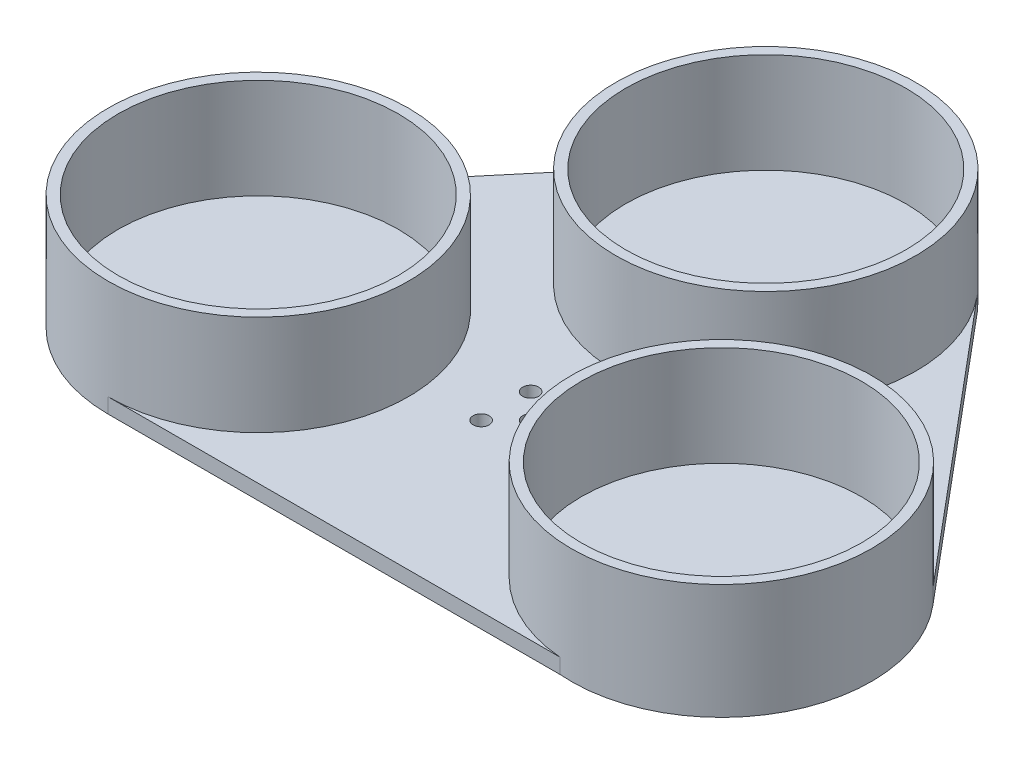
ISO-10303-21;
HEADER;
FILE_DESCRIPTION(('STEP AP214'),'2;1');
FILE_NAME('part.step','',(''),(''),'','','');
FILE_SCHEMA(('AUTOMOTIVE_DESIGN { 1 0 10303 214 1 1 1 1 }'));
ENDSEC;
DATA;
#1=APPLICATION_CONTEXT('core data for automotive mechanical design processes');
#2=APPLICATION_PROTOCOL_DEFINITION('international standard','automotive_design',2000,#1);
#3=PRODUCT_CONTEXT('',#1,'mechanical');
#4=PRODUCT('Part','Part','',(#3));
#5=PRODUCT_RELATED_PRODUCT_CATEGORY('part','',(#4));
#6=PRODUCT_DEFINITION_FORMATION('','',#4);
#7=PRODUCT_DEFINITION_CONTEXT('part definition',#1,'design');
#8=PRODUCT_DEFINITION('design','',#6,#7);
#9=PRODUCT_DEFINITION_SHAPE('','',#8);
#10=(LENGTH_UNIT() NAMED_UNIT(*) SI_UNIT(.MILLI.,.METRE.));
#11=(NAMED_UNIT(*) PLANE_ANGLE_UNIT() SI_UNIT($,.RADIAN.));
#12=(NAMED_UNIT(*) SI_UNIT($,.STERADIAN.) SOLID_ANGLE_UNIT());
#13=UNCERTAINTY_MEASURE_WITH_UNIT(LENGTH_MEASURE(1.E-05),#10,'distance_accuracy_value','');
#14=(GEOMETRIC_REPRESENTATION_CONTEXT(3) GLOBAL_UNCERTAINTY_ASSIGNED_CONTEXT((#13)) GLOBAL_UNIT_ASSIGNED_CONTEXT((#10,
#11,#12)) REPRESENTATION_CONTEXT('',''));
#15=CARTESIAN_POINT('',(0.,0.,0.));
#16=DIRECTION('',(0.,0.,1.));
#17=DIRECTION('',(1.,0.,0.));
#18=AXIS2_PLACEMENT_3D('',#15,#16,#17);
#19=CARTESIAN_POINT('',(-52.5255658839356,3.,-44.0741829605881));
#20=DIRECTION('',(0.766044443118979,0.,0.642787609686538));
#21=DIRECTION('',(0.642787609686538,0.,-0.766044443118979));
#22=AXIS2_PLACEMENT_3D('',#19,#20,#21);
#23=PLANE('',#22);
#24=DIRECTION('',(-0.642787609686538,0.,0.766044443118979));
#25=VECTOR('',#24,1.);
#26=CARTESIAN_POINT('',(-52.5255658839356,0.,-44.0741829605881));
#27=LINE('',#26,#25);
#28=CARTESIAN_POINT('',(-22.9813332935694,0.,-79.2836282905962));
#29=VERTEX_POINT('',#28);
#30=CARTESIAN_POINT('',(-69.2672976851431,0.,-24.1221639402503));
#31=VERTEX_POINT('',#30);
#32=EDGE_CURVE('E173',#29,#31,#27,.T.);
#33=ORIENTED_EDGE('',*,*,#32,.T.);
#34=DIRECTION('',(0.,-1.,0.));
#35=VECTOR('',#34,1.);
#36=CARTESIAN_POINT('',(-69.2672976851431,3.,-24.1221639402503));
#37=LINE('',#36,#35);
#38=CARTESIAN_POINT('',(-69.2672976851431,3.,-24.1221639402503));
#39=VERTEX_POINT('',#38);
#40=EDGE_CURVE('E198',#39,#31,#37,.T.);
#41=ORIENTED_EDGE('',*,*,#40,.F.);
#42=DIRECTION('',(-0.642787609686538,0.,0.766044443118979));
#43=VECTOR('',#42,1.);
#44=CARTESIAN_POINT('',(-52.5255658839356,3.,-44.0741829605881));
#45=LINE('',#44,#43);
#46=CARTESIAN_POINT('',(-22.9813332935694,3.,-79.2836282905962));
#47=VERTEX_POINT('',#46);
#48=EDGE_CURVE('E96',#47,#39,#45,.T.);
#49=ORIENTED_EDGE('',*,*,#48,.F.);
#50=DIRECTION('',(0.,-1.,0.));
#51=VECTOR('',#50,1.);
#52=CARTESIAN_POINT('',(-22.9813332935694,3.,-79.2836282905962));
#53=LINE('',#52,#51);
#54=EDGE_CURVE('E192',#47,#29,#53,.T.);
#55=ORIENTED_EDGE('',*,*,#54,.T.);
#56=EDGE_LOOP('',(#33,#41,#49,#55));
#57=FACE_BOUND('',#56,.T.);
#58=ADVANCED_FACE('F45',(#57),#23,.F.);
#59=CARTESIAN_POINT('',(-46.2859643915737,3.,-4.83853564965411));
#60=DIRECTION('',(0.,-1.,0.));
#61=DIRECTION('',(0.,0.,-1.));
#62=AXIS2_PLACEMENT_3D('',#59,#60,#61);
#63=CYLINDRICAL_SURFACE('',#62,30.);
#64=CARTESIAN_POINT('',(-46.2859643915737,0.,-4.83853564965411));
#65=DIRECTION('',(0.,1.,0.));
#66=DIRECTION('',(0.,0.,1.));
#67=AXIS2_PLACEMENT_3D('',#64,#65,#66);
#68=CIRCLE('',#67,30.);
#69=CARTESIAN_POINT('',(-46.2859643915737,0.,25.1614643503459));
#70=VERTEX_POINT('',#69);
#71=EDGE_CURVE('E179',#31,#70,#68,.T.);
#72=ORIENTED_EDGE('',*,*,#71,.T.);
#73=DIRECTION('',(0.,-1.,0.));
#74=VECTOR('',#73,1.);
#75=CARTESIAN_POINT('',(-46.2859643915737,3.,25.1614643503459));
#76=LINE('',#75,#74);
#77=CARTESIAN_POINT('',(-46.2859643915737,3.,25.1614643503459));
#78=VERTEX_POINT('',#77);
#79=EDGE_CURVE('E197',#78,#70,#76,.T.);
#80=ORIENTED_EDGE('',*,*,#79,.F.);
#81=CARTESIAN_POINT('',(-46.2859643915737,3.,-4.83853564965411));
#82=DIRECTION('',(0.,1.,0.));
#83=DIRECTION('',(0.,0.,1.));
#84=AXIS2_PLACEMENT_3D('',#81,#82,#83);
#85=CIRCLE('',#84,30.);
#86=CARTESIAN_POINT('',(-46.2220692104984,3.,25.1613963070326));
#87=VERTEX_POINT('',#86);
#88=EDGE_CURVE('E134',#78,#87,#85,.T.);
#89=ORIENTED_EDGE('',*,*,#88,.T.);
#90=CARTESIAN_POINT('',(-46.2859643915737,3.,-4.83853564965411));
#91=DIRECTION('',(0.,1.,0.));
#92=DIRECTION('',(0.,0.,1.));
#93=AXIS2_PLACEMENT_3D('',#90,#91,#92);
#94=CIRCLE('',#93,30.);
#95=EDGE_CURVE('E62',#87,#39,#94,.T.);
#96=ORIENTED_EDGE('',*,*,#95,.T.);
#97=ORIENTED_EDGE('',*,*,#40,.T.);
#98=EDGE_LOOP('',(#72,#80,#89,#96,#97));
#99=FACE_BOUND('',#98,.T.);
#100=CARTESIAN_POINT('',(-46.2859643915737,23.,-4.83853564965411));
#101=DIRECTION('',(0.,1.,0.));
#102=DIRECTION('',(0.,0.,1.));
#103=AXIS2_PLACEMENT_3D('',#100,#101,#102);
#104=CIRCLE('',#103,30.);
#105=CARTESIAN_POINT('',(-46.2859643915737,23.,25.1614643503459));
#106=VERTEX_POINT('',#105);
#107=EDGE_CURVE('E166',#106,#106,#104,.T.);
#108=ORIENTED_EDGE('',*,*,#107,.F.);
#109=EDGE_LOOP('',(#108));
#110=FACE_BOUND('',#109,.T.);
#111=ADVANCED_FACE('F223',(#99,#110),#63,.T.);
#112=CARTESIAN_POINT('',(0.0267424478385189,3.,25.1121449812582));
#113=DIRECTION('',(-0.00106492028836114,0.,-0.999999432972229));
#114=DIRECTION('',(-0.999999432972229,0.,0.00106492028836114));
#115=AXIS2_PLACEMENT_3D('',#112,#113,#114);
#116=PLANE('',#115);
#117=DIRECTION('',(0.999999432972229,0.,-0.00106492028836114));
#118=VECTOR('',#117,1.);
#119=CARTESIAN_POINT('',(0.0267424478385189,0.,25.1121449812582));
#120=LINE('',#119,#118);
#121=CARTESIAN_POINT('',(43.8875404004589,0.,25.0654367011699));
#122=VERTEX_POINT('',#121);
#123=EDGE_CURVE('E182',#70,#122,#120,.T.);
#124=ORIENTED_EDGE('',*,*,#123,.T.);
#125=DIRECTION('',(0.,-1.,0.));
#126=VECTOR('',#125,1.);
#127=CARTESIAN_POINT('',(43.8875404004589,3.,25.0654367011699));
#128=LINE('',#127,#126);
#129=CARTESIAN_POINT('',(43.8875404004589,3.,25.0654367011699));
#130=VERTEX_POINT('',#129);
#131=EDGE_CURVE('E124',#130,#122,#128,.T.);
#132=ORIENTED_EDGE('',*,*,#131,.F.);
#133=DIRECTION('',(0.999999432972229,0.,-0.00106492028836114));
#134=VECTOR('',#133,1.);
#135=CARTESIAN_POINT('',(0.0267424478385189,3.,25.1121449812582));
#136=LINE('',#135,#134);
#137=EDGE_CURVE('E137',#87,#130,#136,.T.);
#138=ORIENTED_EDGE('',*,*,#137,.F.);
#139=ORIENTED_EDGE('',*,*,#88,.F.);
#140=ORIENTED_EDGE('',*,*,#79,.T.);
#141=EDGE_LOOP('',(#124,#132,#138,#139,#140));
#142=FACE_BOUND('',#141,.T.);
#143=ADVANCED_FACE('F232',(#142),#116,.F.);
#144=CARTESIAN_POINT('',(46.2859643915737,3.,-4.8385356496541));
#145=DIRECTION('',(0.,-1.,0.));
#146=DIRECTION('',(0.,0.,-1.));
#147=AXIS2_PLACEMENT_3D('',#144,#145,#146);
#148=CYLINDRICAL_SURFACE('',#147,30.);
#149=CARTESIAN_POINT('',(46.2859643915737,0.,-4.8385356496541));
#150=DIRECTION('',(0.,1.,0.));
#151=DIRECTION('',(0.,0.,1.));
#152=AXIS2_PLACEMENT_3D('',#149,#150,#151);
#153=CIRCLE('',#152,30.);
#154=CARTESIAN_POINT('',(69.2662943523183,0.,-24.123359602579));
#155=VERTEX_POINT('',#154);
#156=EDGE_CURVE('E119',#122,#155,#153,.T.);
#157=ORIENTED_EDGE('',*,*,#156,.T.);
#158=DIRECTION('',(0.,-1.,0.));
#159=VECTOR('',#158,1.);
#160=CARTESIAN_POINT('',(69.2662943523183,3.,-24.123359602579));
#161=LINE('',#160,#159);
#162=CARTESIAN_POINT('',(69.2662943523183,3.,-24.123359602579));
#163=VERTEX_POINT('',#162);
#164=EDGE_CURVE('E111',#163,#155,#161,.T.);
#165=ORIENTED_EDGE('',*,*,#164,.F.);
#166=CARTESIAN_POINT('',(46.2859643915737,3.,-4.8385356496541));
#167=DIRECTION('',(0.,1.,0.));
#168=DIRECTION('',(0.,0.,1.));
#169=AXIS2_PLACEMENT_3D('',#166,#167,#168);
#170=CIRCLE('',#169,30.);
#171=EDGE_CURVE('E117',#163,#130,#170,.T.);
#172=ORIENTED_EDGE('',*,*,#171,.T.);
#173=ORIENTED_EDGE('',*,*,#131,.T.);
#174=EDGE_LOOP('',(#157,#165,#172,#173));
#175=FACE_BOUND('',#174,.T.);
#176=CARTESIAN_POINT('',(46.2859643915737,23.,-4.8385356496541));
#177=DIRECTION('',(0.,1.,0.));
#178=DIRECTION('',(0.,0.,1.));
#179=AXIS2_PLACEMENT_3D('',#176,#177,#178);
#180=CIRCLE('',#179,30.);
#181=CARTESIAN_POINT('',(46.2859643915737,23.,25.1614643503459));
#182=VERTEX_POINT('',#181);
#183=EDGE_CURVE('E141',#182,#182,#180,.T.);
#184=ORIENTED_EDGE('',*,*,#183,.F.);
#185=EDGE_LOOP('',(#184));
#186=FACE_BOUND('',#185,.T.);
#187=ADVANCED_FACE('F113',(#175,#186),#148,.T.);
#188=CARTESIAN_POINT('',(52.5222346194224,3.,-44.0760445990114));
#189=DIRECTION('',(0.766010998691486,0.,-0.642827465097495));
#190=DIRECTION('',(-0.642827465097495,0.,-0.766010998691487));
#191=AXIS2_PLACEMENT_3D('',#188,#189,#190);
#192=PLANE('',#191);
#193=DIRECTION('',(0.642827465097495,0.,0.766010998691487));
#194=VECTOR('',#193,1.);
#195=CARTESIAN_POINT('',(52.5222346194224,0.,-44.0760445990114));
#196=LINE('',#195,#194);
#197=CARTESIAN_POINT('',(22.6726925027574,0.,-79.6455851191918));
#198=VERTEX_POINT('',#197);
#199=EDGE_CURVE('E187',#198,#155,#196,.T.);
#200=ORIENTED_EDGE('',*,*,#199,.F.);
#201=DIRECTION('',(0.,-1.,0.));
#202=VECTOR('',#201,1.);
#203=CARTESIAN_POINT('',(22.6726925027574,3.,-79.6455851191918));
#204=LINE('',#203,#202);
#205=CARTESIAN_POINT('',(22.6726925027573,3.,-79.6455851191919));
#206=VERTEX_POINT('',#205);
#207=EDGE_CURVE('E125',#206,#198,#204,.T.);
#208=ORIENTED_EDGE('',*,*,#207,.F.);
#209=CARTESIAN_POINT('',(22.6726925027574,3.,-79.6455851191918));
#210=DIRECTION('',(0.642827465097495,0.,0.766010998691487));
#211=VECTOR('',#210,1.);
#212=LINE('',#209,#211);
#213=CARTESIAN_POINT('',(23.2822277130097,3.,-78.9192460927904));
#214=VERTEX_POINT('',#213);
#215=EDGE_CURVE('E131',#206,#214,#212,.T.);
#216=ORIENTED_EDGE('',*,*,#215,.T.);
#217=DIRECTION('',(0.642827465097495,0.,0.766010998691487));
#218=VECTOR('',#217,1.);
#219=CARTESIAN_POINT('',(52.5222346194224,3.,-44.0760445990114));
#220=LINE('',#219,#218);
#221=EDGE_CURVE('E128',#214,#163,#220,.T.);
#222=ORIENTED_EDGE('',*,*,#221,.T.);
#223=ORIENTED_EDGE('',*,*,#164,.T.);
#224=EDGE_LOOP('',(#200,#208,#216,#222,#223));
#225=FACE_BOUND('',#224,.T.);
#226=ADVANCED_FACE('F129',(#225),#192,.T.);
#227=CARTESIAN_POINT('',(0.,3.,-60.));
#228=DIRECTION('',(0.,-1.,0.));
#229=DIRECTION('',(0.,0.,-1.));
#230=AXIS2_PLACEMENT_3D('',#227,#228,#229);
#231=CYLINDRICAL_SURFACE('',#230,30.);
#232=CARTESIAN_POINT('',(0.,0.,-60.));
#233=DIRECTION('',(0.,1.,0.));
#234=DIRECTION('',(0.,0.,1.));
#235=AXIS2_PLACEMENT_3D('',#232,#233,#234);
#236=CIRCLE('',#235,30.);
#237=EDGE_CURVE('E93',#198,#29,#236,.T.);
#238=ORIENTED_EDGE('',*,*,#237,.T.);
#239=ORIENTED_EDGE('',*,*,#54,.F.);
#240=CARTESIAN_POINT('',(0.,3.,-60.));
#241=DIRECTION('',(0.,1.,0.));
#242=DIRECTION('',(0.,0.,1.));
#243=AXIS2_PLACEMENT_3D('',#240,#241,#242);
#244=CIRCLE('',#243,30.);
#245=EDGE_CURVE('E54',#214,#47,#244,.F.);
#246=ORIENTED_EDGE('',*,*,#245,.F.);
#247=ORIENTED_EDGE('',*,*,#215,.F.);
#248=ORIENTED_EDGE('',*,*,#207,.T.);
#249=EDGE_LOOP('',(#238,#239,#246,#247,#248));
#250=FACE_BOUND('',#249,.T.);
#251=CARTESIAN_POINT('',(0.,23.,-60.));
#252=DIRECTION('',(0.,1.,0.));
#253=DIRECTION('',(0.,0.,1.));
#254=AXIS2_PLACEMENT_3D('',#251,#252,#253);
#255=CIRCLE('',#254,30.);
#256=CARTESIAN_POINT('',(0.,23.,-30.));
#257=VERTEX_POINT('',#256);
#258=EDGE_CURVE('E146',#257,#257,#255,.T.);
#259=ORIENTED_EDGE('',*,*,#258,.F.);
#260=EDGE_LOOP('',(#259));
#261=FACE_BOUND('',#260,.T.);
#262=ADVANCED_FACE('F270',(#250,#261),#231,.T.);
#263=CARTESIAN_POINT('',(0.,3.,0.));
#264=DIRECTION('',(0.,1.,0.));
#265=DIRECTION('',(0.,0.,1.));
#266=AXIS2_PLACEMENT_3D('',#263,#264,#265);
#267=PLANE('',#266);
#268=CARTESIAN_POINT('',(-4.94974746830579,3.,-17.9497474683057));
#269=DIRECTION('',(0.,1.,0.));
#270=DIRECTION('',(0.,0.,1.));
#271=AXIS2_PLACEMENT_3D('',#268,#269,#270);
#272=CIRCLE('',#271,1.6);
#273=CARTESIAN_POINT('',(-4.94974746830579,3.,-16.3497474683057));
#274=VERTEX_POINT('',#273);
#275=EDGE_CURVE('E149',#274,#274,#272,.T.);
#276=ORIENTED_EDGE('',*,*,#275,.F.);
#277=EDGE_LOOP('',(#276));
#278=FACE_BOUND('',#277,.T.);
#279=CARTESIAN_POINT('',(-4.94974746830583,3.,-8.05025253169417));
#280=DIRECTION('',(0.,1.,0.));
#281=DIRECTION('',(0.,0.,1.));
#282=AXIS2_PLACEMENT_3D('',#279,#280,#281);
#283=CIRCLE('',#282,1.59999999999993);
#284=CARTESIAN_POINT('',(-4.94974746830583,3.,-6.45025253169424));
#285=VERTEX_POINT('',#284);
#286=EDGE_CURVE('E347',#285,#285,#283,.T.);
#287=ORIENTED_EDGE('',*,*,#286,.F.);
#288=EDGE_LOOP('',(#287));
#289=FACE_BOUND('',#288,.T.);
#290=CARTESIAN_POINT('',(4.94974746830596,3.,-8.05025253169416));
#291=DIRECTION('',(0.,1.,0.));
#292=DIRECTION('',(0.,0.,1.));
#293=AXIS2_PLACEMENT_3D('',#290,#291,#292);
#294=CIRCLE('',#293,1.6);
#295=CARTESIAN_POINT('',(4.94974746830596,3.,-6.45025253169416));
#296=VERTEX_POINT('',#295);
#297=EDGE_CURVE('E351',#296,#296,#294,.T.);
#298=ORIENTED_EDGE('',*,*,#297,.F.);
#299=EDGE_LOOP('',(#298));
#300=FACE_BOUND('',#299,.T.);
#301=CARTESIAN_POINT('',(4.94974746830583,3.,-17.9497474683058));
#302=DIRECTION('',(0.,1.,0.));
#303=DIRECTION('',(0.,0.,1.));
#304=AXIS2_PLACEMENT_3D('',#301,#302,#303);
#305=CIRCLE('',#304,1.59999999999999);
#306=CARTESIAN_POINT('',(4.94974746830583,3.,-16.3497474683058));
#307=VERTEX_POINT('',#306);
#308=EDGE_CURVE('E355',#307,#307,#305,.T.);
#309=ORIENTED_EDGE('',*,*,#308,.F.);
#310=EDGE_LOOP('',(#309));
#311=FACE_BOUND('',#310,.T.);
#312=CARTESIAN_POINT('',(0.,3.,-13.));
#313=DIRECTION('',(0.,1.,0.));
#314=DIRECTION('',(0.,0.,1.));
#315=AXIS2_PLACEMENT_3D('',#312,#313,#314);
#316=CIRCLE('',#315,1.6);
#317=CARTESIAN_POINT('',(0.,3.,-11.4));
#318=VERTEX_POINT('',#317);
#319=EDGE_CURVE('E358',#318,#318,#316,.T.);
#320=ORIENTED_EDGE('',*,*,#319,.F.);
#321=EDGE_LOOP('',(#320));
#322=FACE_BOUND('',#321,.T.);
#323=ORIENTED_EDGE('',*,*,#137,.T.);
#324=ORIENTED_EDGE('',*,*,#171,.F.);
#325=ORIENTED_EDGE('',*,*,#221,.F.);
#326=ORIENTED_EDGE('',*,*,#245,.T.);
#327=ORIENTED_EDGE('',*,*,#48,.T.);
#328=ORIENTED_EDGE('',*,*,#95,.F.);
#329=EDGE_LOOP('',(#323,#324,#325,#326,#327,#328));
#330=FACE_BOUND('',#329,.T.);
#331=ADVANCED_FACE('F136',(#278,#289,#300,#311,#322,#330),#267,.T.);
#332=CARTESIAN_POINT('',(0.,0.,0.));
#333=DIRECTION('',(0.,1.,0.));
#334=DIRECTION('',(0.,0.,1.));
#335=AXIS2_PLACEMENT_3D('',#332,#333,#334);
#336=PLANE('',#335);
#337=CARTESIAN_POINT('',(-4.94974746830579,0.,-17.9497474683057));
#338=DIRECTION('',(0.,1.,0.));
#339=DIRECTION('',(0.,0.,1.));
#340=AXIS2_PLACEMENT_3D('',#337,#338,#339);
#341=CIRCLE('',#340,1.6);
#342=CARTESIAN_POINT('',(-4.94974746830579,0.,-16.3497474683057));
#343=VERTEX_POINT('',#342);
#344=EDGE_CURVE('E48',#343,#343,#341,.T.);
#345=ORIENTED_EDGE('',*,*,#344,.T.);
#346=EDGE_LOOP('',(#345));
#347=FACE_BOUND('',#346,.T.);
#348=CARTESIAN_POINT('',(-4.94974746830583,0.,-8.05025253169417));
#349=DIRECTION('',(0.,1.,0.));
#350=DIRECTION('',(0.,0.,1.));
#351=AXIS2_PLACEMENT_3D('',#348,#349,#350);
#352=CIRCLE('',#351,1.59999999999993);
#353=CARTESIAN_POINT('',(-4.94974746830583,0.,-6.45025253169424));
#354=VERTEX_POINT('',#353);
#355=EDGE_CURVE('E373',#354,#354,#352,.T.);
#356=ORIENTED_EDGE('',*,*,#355,.T.);
#357=EDGE_LOOP('',(#356));
#358=FACE_BOUND('',#357,.T.);
#359=CARTESIAN_POINT('',(4.94974746830596,0.,-8.05025253169416));
#360=DIRECTION('',(0.,1.,0.));
#361=DIRECTION('',(0.,0.,1.));
#362=AXIS2_PLACEMENT_3D('',#359,#360,#361);
#363=CIRCLE('',#362,1.6);
#364=CARTESIAN_POINT('',(4.94974746830596,0.,-6.45025253169416));
#365=VERTEX_POINT('',#364);
#366=EDGE_CURVE('E371',#365,#365,#363,.T.);
#367=ORIENTED_EDGE('',*,*,#366,.T.);
#368=EDGE_LOOP('',(#367));
#369=FACE_BOUND('',#368,.T.);
#370=CARTESIAN_POINT('',(4.94974746830583,0.,-17.9497474683058));
#371=DIRECTION('',(0.,1.,0.));
#372=DIRECTION('',(0.,0.,1.));
#373=AXIS2_PLACEMENT_3D('',#370,#371,#372);
#374=CIRCLE('',#373,1.59999999999999);
#375=CARTESIAN_POINT('',(4.94974746830583,0.,-16.3497474683058));
#376=VERTEX_POINT('',#375);
#377=EDGE_CURVE('E360',#376,#376,#374,.T.);
#378=ORIENTED_EDGE('',*,*,#377,.T.);
#379=EDGE_LOOP('',(#378));
#380=FACE_BOUND('',#379,.T.);
#381=CARTESIAN_POINT('',(0.,0.,-13.));
#382=DIRECTION('',(0.,1.,0.));
#383=DIRECTION('',(0.,0.,1.));
#384=AXIS2_PLACEMENT_3D('',#381,#382,#383);
#385=CIRCLE('',#384,1.6);
#386=CARTESIAN_POINT('',(0.,0.,-11.4));
#387=VERTEX_POINT('',#386);
#388=EDGE_CURVE('E361',#387,#387,#385,.T.);
#389=ORIENTED_EDGE('',*,*,#388,.T.);
#390=EDGE_LOOP('',(#389));
#391=FACE_BOUND('',#390,.T.);
#392=ORIENTED_EDGE('',*,*,#32,.F.);
#393=ORIENTED_EDGE('',*,*,#237,.F.);
#394=ORIENTED_EDGE('',*,*,#199,.T.);
#395=ORIENTED_EDGE('',*,*,#156,.F.);
#396=ORIENTED_EDGE('',*,*,#123,.F.);
#397=ORIENTED_EDGE('',*,*,#71,.F.);
#398=EDGE_LOOP('',(#392,#393,#394,#395,#396,#397));
#399=FACE_BOUND('',#398,.T.);
#400=ADVANCED_FACE('F250',(#347,#358,#369,#380,#391,#399),#336,.F.);
#401=CARTESIAN_POINT('',(-46.2859643915737,23.,-4.83853564965411));
#402=DIRECTION('',(0.,1.,0.));
#403=DIRECTION('',(0.,0.,1.));
#404=AXIS2_PLACEMENT_3D('',#401,#402,#403);
#405=PLANE('',#404);
#406=ORIENTED_EDGE('',*,*,#107,.T.);
#407=EDGE_LOOP('',(#406));
#408=FACE_BOUND('',#407,.T.);
#409=CARTESIAN_POINT('',(-46.2859643915737,23.,-4.83853564965411));
#410=DIRECTION('',(0.,1.,0.));
#411=DIRECTION('',(0.,0.,1.));
#412=AXIS2_PLACEMENT_3D('',#409,#410,#411);
#413=CIRCLE('',#412,28.);
#414=CARTESIAN_POINT('',(-46.2859643915737,23.,23.1614643503459));
#415=VERTEX_POINT('',#414);
#416=EDGE_CURVE('E162',#415,#415,#413,.T.);
#417=ORIENTED_EDGE('',*,*,#416,.F.);
#418=EDGE_LOOP('',(#417));
#419=FACE_BOUND('',#418,.T.);
#420=ADVANCED_FACE('F339',(#408,#419),#405,.T.);
#421=CARTESIAN_POINT('',(-46.2859643915737,23.,-4.83853564965411));
#422=DIRECTION('',(0.,-1.,0.));
#423=DIRECTION('',(0.,0.,-1.));
#424=AXIS2_PLACEMENT_3D('',#421,#422,#423);
#425=CYLINDRICAL_SURFACE('',#424,28.);
#426=ORIENTED_EDGE('',*,*,#416,.T.);
#427=EDGE_LOOP('',(#426));
#428=FACE_BOUND('',#427,.T.);
#429=CARTESIAN_POINT('',(-46.2859643915737,3.,-4.83853564965411));
#430=DIRECTION('',(0.,1.,0.));
#431=DIRECTION('',(0.,0.,1.));
#432=AXIS2_PLACEMENT_3D('',#429,#430,#431);
#433=CIRCLE('',#432,28.);
#434=CARTESIAN_POINT('',(-46.2859643915737,3.,23.1614643503459));
#435=VERTEX_POINT('',#434);
#436=EDGE_CURVE('E161',#435,#435,#433,.T.);
#437=ORIENTED_EDGE('',*,*,#436,.F.);
#438=EDGE_LOOP('',(#437));
#439=FACE_BOUND('',#438,.T.);
#440=ADVANCED_FACE('F319',(#428,#439),#425,.F.);
#441=ORIENTED_EDGE('',*,*,#436,.T.);
#442=EDGE_LOOP('',(#441));
#443=FACE_BOUND('',#442,.T.);
#444=ADVANCED_FACE('F296',(#443),#267,.T.);
#445=CARTESIAN_POINT('',(0.,23.,-60.));
#446=DIRECTION('',(0.,1.,0.));
#447=DIRECTION('',(0.,0.,1.));
#448=AXIS2_PLACEMENT_3D('',#445,#446,#447);
#449=PLANE('',#448);
#450=ORIENTED_EDGE('',*,*,#258,.T.);
#451=EDGE_LOOP('',(#450));
#452=FACE_BOUND('',#451,.T.);
#453=CARTESIAN_POINT('',(0.,23.,-60.));
#454=DIRECTION('',(0.,1.,0.));
#455=DIRECTION('',(0.,0.,1.));
#456=AXIS2_PLACEMENT_3D('',#453,#454,#455);
#457=CIRCLE('',#456,28.);
#458=CARTESIAN_POINT('',(0.,23.,-32.));
#459=VERTEX_POINT('',#458);
#460=EDGE_CURVE('E157',#459,#459,#457,.T.);
#461=ORIENTED_EDGE('',*,*,#460,.F.);
#462=EDGE_LOOP('',(#461));
#463=FACE_BOUND('',#462,.T.);
#464=ADVANCED_FACE('F292',(#452,#463),#449,.T.);
#465=CARTESIAN_POINT('',(0.,23.,-60.));
#466=DIRECTION('',(0.,-1.,0.));
#467=DIRECTION('',(0.,0.,-1.));
#468=AXIS2_PLACEMENT_3D('',#465,#466,#467);
#469=CYLINDRICAL_SURFACE('',#468,28.);
#470=ORIENTED_EDGE('',*,*,#460,.T.);
#471=EDGE_LOOP('',(#470));
#472=FACE_BOUND('',#471,.T.);
#473=CARTESIAN_POINT('',(0.,3.,-60.));
#474=DIRECTION('',(0.,1.,0.));
#475=DIRECTION('',(0.,0.,1.));
#476=AXIS2_PLACEMENT_3D('',#473,#474,#475);
#477=CIRCLE('',#476,28.);
#478=CARTESIAN_POINT('',(0.,3.,-32.));
#479=VERTEX_POINT('',#478);
#480=EDGE_CURVE('E209',#479,#479,#477,.F.);
#481=ORIENTED_EDGE('',*,*,#480,.T.);
#482=EDGE_LOOP('',(#481));
#483=FACE_BOUND('',#482,.T.);
#484=ADVANCED_FACE('F295',(#472,#483),#469,.F.);
#485=ORIENTED_EDGE('',*,*,#480,.F.);
#486=EDGE_LOOP('',(#485));
#487=FACE_BOUND('',#486,.T.);
#488=ADVANCED_FACE('F302',(#487),#267,.T.);
#489=CARTESIAN_POINT('',(46.2859643915737,23.,-4.8385356496541));
#490=DIRECTION('',(0.,1.,0.));
#491=DIRECTION('',(0.,0.,1.));
#492=AXIS2_PLACEMENT_3D('',#489,#490,#491);
#493=PLANE('',#492);
#494=ORIENTED_EDGE('',*,*,#183,.T.);
#495=EDGE_LOOP('',(#494));
#496=FACE_BOUND('',#495,.T.);
#497=CARTESIAN_POINT('',(46.2859643915737,23.,-4.8385356496541));
#498=DIRECTION('',(0.,1.,0.));
#499=DIRECTION('',(0.,0.,1.));
#500=AXIS2_PLACEMENT_3D('',#497,#498,#499);
#501=CIRCLE('',#500,28.);
#502=CARTESIAN_POINT('',(46.2859643915737,23.,23.1614643503459));
#503=VERTEX_POINT('',#502);
#504=EDGE_CURVE('E140',#503,#503,#501,.T.);
#505=ORIENTED_EDGE('',*,*,#504,.F.);
#506=EDGE_LOOP('',(#505));
#507=FACE_BOUND('',#506,.T.);
#508=ADVANCED_FACE('F309',(#496,#507),#493,.T.);
#509=CARTESIAN_POINT('',(46.2859643915737,23.,-4.8385356496541));
#510=DIRECTION('',(0.,-1.,0.));
#511=DIRECTION('',(0.,0.,-1.));
#512=AXIS2_PLACEMENT_3D('',#509,#510,#511);
#513=CYLINDRICAL_SURFACE('',#512,28.);
#514=ORIENTED_EDGE('',*,*,#504,.T.);
#515=EDGE_LOOP('',(#514));
#516=FACE_BOUND('',#515,.T.);
#517=CARTESIAN_POINT('',(46.2859643915737,3.,-4.8385356496541));
#518=DIRECTION('',(0.,1.,0.));
#519=DIRECTION('',(0.,0.,1.));
#520=AXIS2_PLACEMENT_3D('',#517,#518,#519);
#521=CIRCLE('',#520,28.);
#522=CARTESIAN_POINT('',(46.2859643915737,3.,23.1614643503459));
#523=VERTEX_POINT('',#522);
#524=EDGE_CURVE('E11',#523,#523,#521,.F.);
#525=ORIENTED_EDGE('',*,*,#524,.T.);
#526=EDGE_LOOP('',(#525));
#527=FACE_BOUND('',#526,.T.);
#528=ADVANCED_FACE('F314',(#516,#527),#513,.F.);
#529=ORIENTED_EDGE('',*,*,#524,.F.);
#530=EDGE_LOOP('',(#529));
#531=FACE_BOUND('',#530,.T.);
#532=ADVANCED_FACE('F310',(#531),#267,.T.);
#533=CARTESIAN_POINT('',(0.,-2.49999999998515E-05,-13.));
#534=DIRECTION('',(0.,1.,0.));
#535=DIRECTION('',(0.,0.,1.));
#536=AXIS2_PLACEMENT_3D('',#533,#534,#535);
#537=CYLINDRICAL_SURFACE('',#536,1.6);
#538=ORIENTED_EDGE('',*,*,#319,.T.);
#539=EDGE_LOOP('',(#538));
#540=FACE_BOUND('',#539,.T.);
#541=ORIENTED_EDGE('',*,*,#388,.F.);
#542=EDGE_LOOP('',(#541));
#543=FACE_BOUND('',#542,.T.);
#544=ADVANCED_FACE('F322',(#540,#543),#537,.F.);
#545=CARTESIAN_POINT('',(4.94974746830583,-2.49999999998515E-05,-17.9497474683058));
#546=DIRECTION('',(0.,1.,0.));
#547=DIRECTION('',(0.,0.,1.));
#548=AXIS2_PLACEMENT_3D('',#545,#546,#547);
#549=CYLINDRICAL_SURFACE('',#548,1.59999999999999);
#550=ORIENTED_EDGE('',*,*,#308,.T.);
#551=EDGE_LOOP('',(#550));
#552=FACE_BOUND('',#551,.T.);
#553=ORIENTED_EDGE('',*,*,#377,.F.);
#554=EDGE_LOOP('',(#553));
#555=FACE_BOUND('',#554,.T.);
#556=ADVANCED_FACE('F328',(#552,#555),#549,.F.);
#557=CARTESIAN_POINT('',(4.94974746830596,-2.49999999998515E-05,-8.05025253169416));
#558=DIRECTION('',(0.,1.,0.));
#559=DIRECTION('',(0.,0.,1.));
#560=AXIS2_PLACEMENT_3D('',#557,#558,#559);
#561=CYLINDRICAL_SURFACE('',#560,1.6);
#562=ORIENTED_EDGE('',*,*,#297,.T.);
#563=EDGE_LOOP('',(#562));
#564=FACE_BOUND('',#563,.T.);
#565=ORIENTED_EDGE('',*,*,#366,.F.);
#566=EDGE_LOOP('',(#565));
#567=FACE_BOUND('',#566,.T.);
#568=ADVANCED_FACE('F389',(#564,#567),#561,.F.);
#569=CARTESIAN_POINT('',(-4.94974746830583,-2.49999999998515E-05,-8.05025253169417));
#570=DIRECTION('',(0.,1.,0.));
#571=DIRECTION('',(0.,0.,1.));
#572=AXIS2_PLACEMENT_3D('',#569,#570,#571);
#573=CYLINDRICAL_SURFACE('',#572,1.59999999999993);
#574=ORIENTED_EDGE('',*,*,#286,.T.);
#575=EDGE_LOOP('',(#574));
#576=FACE_BOUND('',#575,.T.);
#577=ORIENTED_EDGE('',*,*,#355,.F.);
#578=EDGE_LOOP('',(#577));
#579=FACE_BOUND('',#578,.T.);
#580=ADVANCED_FACE('F391',(#576,#579),#573,.F.);
#581=CARTESIAN_POINT('',(-4.94974746830579,-2.49999999998515E-05,-17.9497474683057));
#582=DIRECTION('',(0.,1.,0.));
#583=DIRECTION('',(0.,0.,1.));
#584=AXIS2_PLACEMENT_3D('',#581,#582,#583);
#585=CYLINDRICAL_SURFACE('',#584,1.6);
#586=ORIENTED_EDGE('',*,*,#275,.T.);
#587=EDGE_LOOP('',(#586));
#588=FACE_BOUND('',#587,.T.);
#589=ORIENTED_EDGE('',*,*,#344,.F.);
#590=EDGE_LOOP('',(#589));
#591=FACE_BOUND('',#590,.T.);
#592=ADVANCED_FACE('F398',(#588,#591),#585,.F.);
#593=CLOSED_SHELL('',(#58,#111,#143,#187,#226,#262,#331,#400,#420,#440,#444,#464,#484,#488,#508,
#528,#532,#544,#556,#568,#580,#592));
#594=MANIFOLD_SOLID_BREP('B2',#593);
#595=ADVANCED_BREP_SHAPE_REPRESENTATION('',(#18,#594),#14);
#596=SHAPE_DEFINITION_REPRESENTATION(#9,#595);
ENDSEC;
END-ISO-10303-21;
